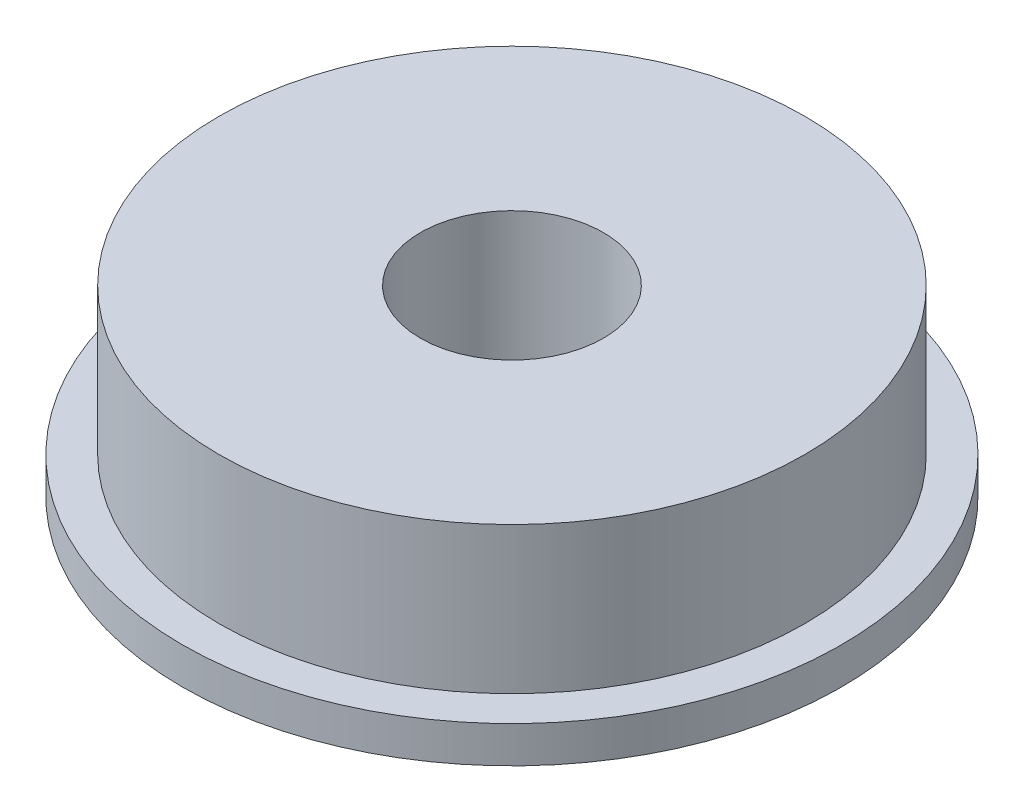
ISO-10303-21;
HEADER;
FILE_DESCRIPTION(('STEP AP214'),'2;1');
FILE_NAME('part.step','',(''),(''),'','','');
FILE_SCHEMA(('AUTOMOTIVE_DESIGN { 1 0 10303 214 1 1 1 1 }'));
ENDSEC;
DATA;
#1=APPLICATION_CONTEXT('core data for automotive mechanical design processes');
#2=APPLICATION_PROTOCOL_DEFINITION('international standard','automotive_design',2000,#1);
#3=PRODUCT_CONTEXT('',#1,'mechanical');
#4=PRODUCT('Part','Part','',(#3));
#5=PRODUCT_RELATED_PRODUCT_CATEGORY('part','',(#4));
#6=PRODUCT_DEFINITION_FORMATION('','',#4);
#7=PRODUCT_DEFINITION_CONTEXT('part definition',#1,'design');
#8=PRODUCT_DEFINITION('design','',#6,#7);
#9=PRODUCT_DEFINITION_SHAPE('','',#8);
#10=(LENGTH_UNIT() NAMED_UNIT(*) SI_UNIT(.MILLI.,.METRE.));
#11=(NAMED_UNIT(*) PLANE_ANGLE_UNIT() SI_UNIT($,.RADIAN.));
#12=(NAMED_UNIT(*) SI_UNIT($,.STERADIAN.) SOLID_ANGLE_UNIT());
#13=UNCERTAINTY_MEASURE_WITH_UNIT(LENGTH_MEASURE(1.E-05),#10,'distance_accuracy_value','');
#14=(GEOMETRIC_REPRESENTATION_CONTEXT(3) GLOBAL_UNCERTAINTY_ASSIGNED_CONTEXT((#13)) GLOBAL_UNIT_ASSIGNED_CONTEXT((#10,
#11,#12)) REPRESENTATION_CONTEXT('',''));
#15=CARTESIAN_POINT('',(0.,0.,0.));
#16=DIRECTION('',(0.,0.,1.));
#17=DIRECTION('',(1.,0.,0.));
#18=AXIS2_PLACEMENT_3D('',#15,#16,#17);
#19=CARTESIAN_POINT('',(0.,1.,0.));
#20=DIRECTION('',(0.,1.,0.));
#21=DIRECTION('',(0.,0.,1.));
#22=AXIS2_PLACEMENT_3D('',#19,#20,#21);
#23=PLANE('',#22);
#24=CARTESIAN_POINT('',(0.,1.,0.));
#25=DIRECTION('',(0.,1.,0.));
#26=DIRECTION('',(0.,0.,1.));
#27=AXIS2_PLACEMENT_3D('',#24,#25,#26);
#28=CIRCLE('',#27,8.);
#29=CARTESIAN_POINT('',(0.,1.,8.));
#30=VERTEX_POINT('',#29);
#31=EDGE_CURVE('E10',#30,#30,#28,.T.);
#32=ORIENTED_EDGE('',*,*,#31,.F.);
#33=EDGE_LOOP('',(#32));
#34=FACE_BOUND('',#33,.T.);
#35=CARTESIAN_POINT('',(0.,1.,0.));
#36=DIRECTION('',(0.,1.,0.));
#37=DIRECTION('',(0.,0.,1.));
#38=AXIS2_PLACEMENT_3D('',#35,#36,#37);
#39=CIRCLE('',#38,9.);
#40=CARTESIAN_POINT('',(0.,1.,9.));
#41=VERTEX_POINT('',#40);
#42=EDGE_CURVE('E39',#41,#41,#39,.T.);
#43=ORIENTED_EDGE('',*,*,#42,.T.);
#44=EDGE_LOOP('',(#43));
#45=FACE_BOUND('',#44,.T.);
#46=ADVANCED_FACE('F31',(#34,#45),#23,.T.);
#47=CARTESIAN_POINT('',(0.,0.,0.));
#48=DIRECTION('',(0.,1.,0.));
#49=DIRECTION('',(0.,0.,1.));
#50=AXIS2_PLACEMENT_3D('',#47,#48,#49);
#51=PLANE('',#50);
#52=CARTESIAN_POINT('',(0.,0.,0.));
#53=DIRECTION('',(0.,1.,0.));
#54=DIRECTION('',(0.,0.,1.));
#55=AXIS2_PLACEMENT_3D('',#52,#53,#54);
#56=CIRCLE('',#55,9.);
#57=CARTESIAN_POINT('',(0.,0.,9.));
#58=VERTEX_POINT('',#57);
#59=EDGE_CURVE('E35',#58,#58,#56,.T.);
#60=ORIENTED_EDGE('',*,*,#59,.F.);
#61=EDGE_LOOP('',(#60));
#62=FACE_BOUND('',#61,.T.);
#63=CARTESIAN_POINT('',(0.,0.,0.));
#64=DIRECTION('',(0.,1.,0.));
#65=DIRECTION('',(0.,0.,1.));
#66=AXIS2_PLACEMENT_3D('',#63,#64,#65);
#67=CIRCLE('',#66,2.5);
#68=CARTESIAN_POINT('',(0.,0.,2.5));
#69=VERTEX_POINT('',#68);
#70=EDGE_CURVE('E48',#69,#69,#67,.T.);
#71=ORIENTED_EDGE('',*,*,#70,.T.);
#72=EDGE_LOOP('',(#71));
#73=FACE_BOUND('',#72,.T.);
#74=ADVANCED_FACE('F75',(#62,#73),#51,.F.);
#75=CARTESIAN_POINT('',(0.,1.,0.));
#76=DIRECTION('',(0.,-1.,0.));
#77=DIRECTION('',(0.,0.,-1.));
#78=AXIS2_PLACEMENT_3D('',#75,#76,#77);
#79=CYLINDRICAL_SURFACE('',#78,9.);
#80=ORIENTED_EDGE('',*,*,#42,.F.);
#81=EDGE_LOOP('',(#80));
#82=FACE_BOUND('',#81,.T.);
#83=ORIENTED_EDGE('',*,*,#59,.T.);
#84=EDGE_LOOP('',(#83));
#85=FACE_BOUND('',#84,.T.);
#86=ADVANCED_FACE('F33',(#82,#85),#79,.T.);
#87=CARTESIAN_POINT('',(0.,1.,0.));
#88=DIRECTION('',(0.,-1.,0.));
#89=DIRECTION('',(0.,0.,-1.));
#90=AXIS2_PLACEMENT_3D('',#87,#88,#89);
#91=CYLINDRICAL_SURFACE('',#90,2.5);
#92=ORIENTED_EDGE('',*,*,#70,.F.);
#93=EDGE_LOOP('',(#92));
#94=FACE_BOUND('',#93,.T.);
#95=CARTESIAN_POINT('',(0.,5.,0.));
#96=DIRECTION('',(0.,1.,0.));
#97=DIRECTION('',(0.,0.,1.));
#98=AXIS2_PLACEMENT_3D('',#95,#96,#97);
#99=CIRCLE('',#98,2.5);
#100=CARTESIAN_POINT('',(0.,5.,2.5));
#101=VERTEX_POINT('',#100);
#102=EDGE_CURVE('E54',#101,#101,#99,.T.);
#103=ORIENTED_EDGE('',*,*,#102,.T.);
#104=EDGE_LOOP('',(#103));
#105=FACE_BOUND('',#104,.T.);
#106=ADVANCED_FACE('F60',(#94,#105),#91,.F.);
#107=CARTESIAN_POINT('',(0.,5.,0.));
#108=DIRECTION('',(0.,1.,0.));
#109=DIRECTION('',(0.,0.,1.));
#110=AXIS2_PLACEMENT_3D('',#107,#108,#109);
#111=PLANE('',#110);
#112=CARTESIAN_POINT('',(0.,5.,0.));
#113=DIRECTION('',(0.,1.,0.));
#114=DIRECTION('',(0.,0.,1.));
#115=AXIS2_PLACEMENT_3D('',#112,#113,#114);
#116=CIRCLE('',#115,8.);
#117=CARTESIAN_POINT('',(0.,5.,8.));
#118=VERTEX_POINT('',#117);
#119=EDGE_CURVE('E46',#118,#118,#116,.T.);
#120=ORIENTED_EDGE('',*,*,#119,.T.);
#121=EDGE_LOOP('',(#120));
#122=FACE_BOUND('',#121,.T.);
#123=ORIENTED_EDGE('',*,*,#102,.F.);
#124=EDGE_LOOP('',(#123));
#125=FACE_BOUND('',#124,.T.);
#126=ADVANCED_FACE('F62',(#122,#125),#111,.T.);
#127=CARTESIAN_POINT('',(0.,5.,0.));
#128=DIRECTION('',(0.,-1.,0.));
#129=DIRECTION('',(0.,0.,-1.));
#130=AXIS2_PLACEMENT_3D('',#127,#128,#129);
#131=CYLINDRICAL_SURFACE('',#130,8.);
#132=ORIENTED_EDGE('',*,*,#119,.F.);
#133=EDGE_LOOP('',(#132));
#134=FACE_BOUND('',#133,.T.);
#135=ORIENTED_EDGE('',*,*,#31,.T.);
#136=EDGE_LOOP('',(#135));
#137=FACE_BOUND('',#136,.T.);
#138=ADVANCED_FACE('F64',(#134,#137),#131,.T.);
#139=CLOSED_SHELL('',(#46,#74,#86,#106,#126,#138));
#140=MANIFOLD_SOLID_BREP('B2',#139);
#141=ADVANCED_BREP_SHAPE_REPRESENTATION('',(#18,#140),#14);
#142=SHAPE_DEFINITION_REPRESENTATION(#9,#141);
ENDSEC;
END-ISO-10303-21;
